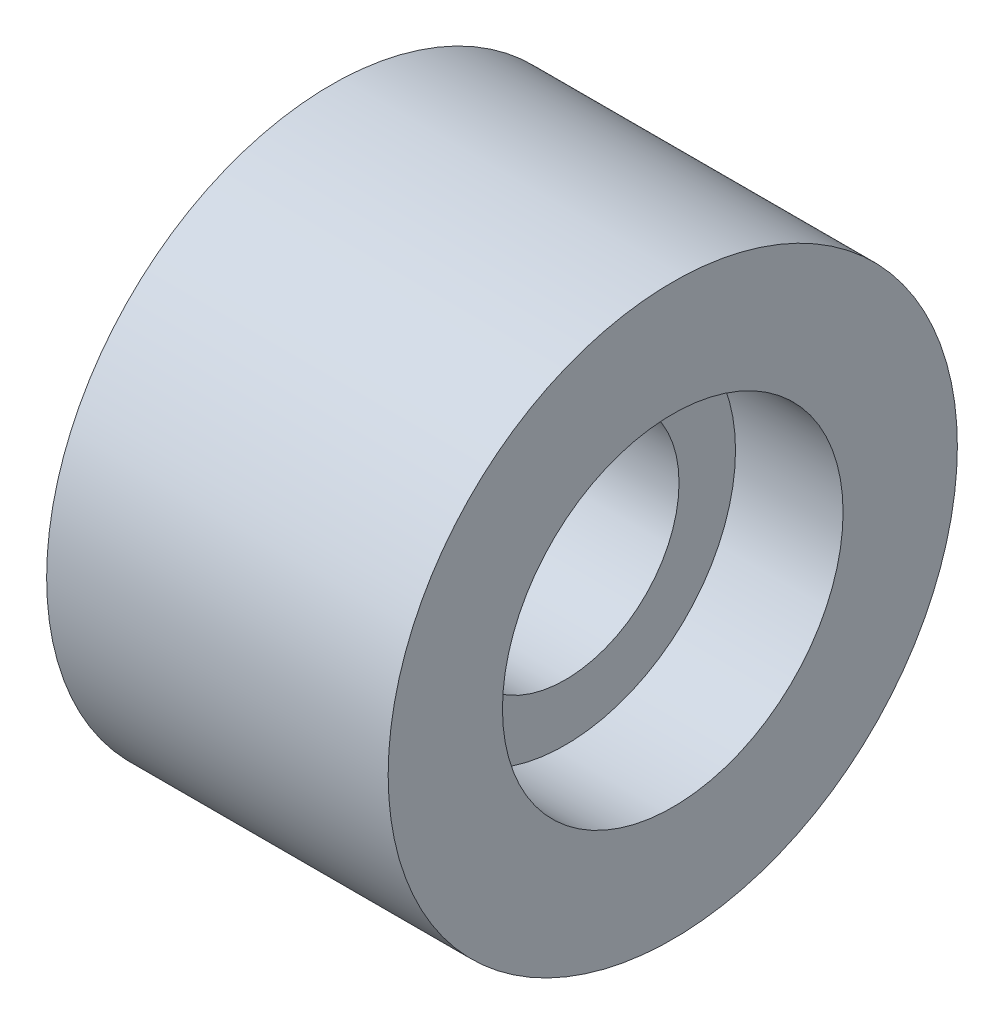
ISO-10303-21;
HEADER;
FILE_DESCRIPTION(('STEP AP214'),'2;1');
FILE_NAME('part.step','',(''),(''),'','','');
FILE_SCHEMA(('AUTOMOTIVE_DESIGN { 1 0 10303 214 1 1 1 1 }'));
ENDSEC;
DATA;
#1=APPLICATION_CONTEXT('core data for automotive mechanical design processes');
#2=APPLICATION_PROTOCOL_DEFINITION('international standard','automotive_design',2000,#1);
#3=PRODUCT_CONTEXT('',#1,'mechanical');
#4=PRODUCT('Part','Part','',(#3));
#5=PRODUCT_RELATED_PRODUCT_CATEGORY('part','',(#4));
#6=PRODUCT_DEFINITION_FORMATION('','',#4);
#7=PRODUCT_DEFINITION_CONTEXT('part definition',#1,'design');
#8=PRODUCT_DEFINITION('design','',#6,#7);
#9=PRODUCT_DEFINITION_SHAPE('','',#8);
#10=(LENGTH_UNIT() NAMED_UNIT(*) SI_UNIT(.MILLI.,.METRE.));
#11=(NAMED_UNIT(*) PLANE_ANGLE_UNIT() SI_UNIT($,.RADIAN.));
#12=(NAMED_UNIT(*) SI_UNIT($,.STERADIAN.) SOLID_ANGLE_UNIT());
#13=UNCERTAINTY_MEASURE_WITH_UNIT(LENGTH_MEASURE(1.E-05),#10,'distance_accuracy_value','');
#14=(GEOMETRIC_REPRESENTATION_CONTEXT(3) GLOBAL_UNCERTAINTY_ASSIGNED_CONTEXT((#13)) GLOBAL_UNIT_ASSIGNED_CONTEXT((#10,
#11,#12)) REPRESENTATION_CONTEXT('',''));
#15=CARTESIAN_POINT('',(0.,0.,0.));
#16=DIRECTION('',(0.,0.,1.));
#17=DIRECTION('',(1.,0.,0.));
#18=AXIS2_PLACEMENT_3D('',#15,#16,#17);
#19=CARTESIAN_POINT('',(6.,0.,0.));
#20=DIRECTION('',(-1.,0.,0.));
#21=DIRECTION('',(0.,0.,1.));
#22=AXIS2_PLACEMENT_3D('',#19,#20,#21);
#23=CYLINDRICAL_SURFACE('',#22,9.5);
#24=CARTESIAN_POINT('',(6.,0.,0.));
#25=DIRECTION('',(1.,0.,0.));
#26=DIRECTION('',(0.,0.,-1.));
#27=AXIS2_PLACEMENT_3D('',#24,#25,#26);
#28=CIRCLE('',#27,9.5);
#29=CARTESIAN_POINT('',(6.,0.,-9.5));
#30=VERTEX_POINT('',#29);
#31=EDGE_CURVE('E51',#30,#30,#28,.T.);
#32=ORIENTED_EDGE('',*,*,#31,.T.);
#33=EDGE_LOOP('',(#32));
#34=FACE_BOUND('',#33,.T.);
#35=CARTESIAN_POINT('',(0.,0.,0.));
#36=DIRECTION('',(1.,0.,0.));
#37=DIRECTION('',(0.,0.,-1.));
#38=AXIS2_PLACEMENT_3D('',#35,#36,#37);
#39=CIRCLE('',#38,9.5);
#40=CARTESIAN_POINT('',(0.,0.,-9.5));
#41=VERTEX_POINT('',#40);
#42=EDGE_CURVE('E46',#41,#41,#39,.T.);
#43=ORIENTED_EDGE('',*,*,#42,.F.);
#44=EDGE_LOOP('',(#43));
#45=FACE_BOUND('',#44,.T.);
#46=ADVANCED_FACE('F43',(#34,#45),#23,.F.);
#47=CARTESIAN_POINT('',(6.,0.,0.));
#48=DIRECTION('',(-1.,0.,0.));
#49=DIRECTION('',(0.,0.,1.));
#50=AXIS2_PLACEMENT_3D('',#47,#48,#49);
#51=CYLINDRICAL_SURFACE('',#50,15.875);
#52=CARTESIAN_POINT('',(6.,0.,0.));
#53=DIRECTION('',(1.,0.,0.));
#54=DIRECTION('',(0.,0.,-1.));
#55=AXIS2_PLACEMENT_3D('',#52,#53,#54);
#56=CIRCLE('',#55,15.875);
#57=CARTESIAN_POINT('',(6.,0.,-15.875));
#58=VERTEX_POINT('',#57);
#59=EDGE_CURVE('E10',#58,#58,#56,.T.);
#60=ORIENTED_EDGE('',*,*,#59,.F.);
#61=EDGE_LOOP('',(#60));
#62=FACE_BOUND('',#61,.T.);
#63=CARTESIAN_POINT('',(-13.050000062,0.,0.));
#64=DIRECTION('',(1.,0.,0.));
#65=DIRECTION('',(0.,0.,-1.));
#66=AXIS2_PLACEMENT_3D('',#63,#64,#65);
#67=CIRCLE('',#66,15.875);
#68=CARTESIAN_POINT('',(-13.050000062,0.,-15.875));
#69=VERTEX_POINT('',#68);
#70=EDGE_CURVE('E64',#69,#69,#67,.T.);
#71=ORIENTED_EDGE('',*,*,#70,.T.);
#72=EDGE_LOOP('',(#71));
#73=FACE_BOUND('',#72,.T.);
#74=ADVANCED_FACE('F89',(#62,#73),#51,.T.);
#75=CARTESIAN_POINT('',(6.,0.,0.));
#76=DIRECTION('',(1.,0.,0.));
#77=DIRECTION('',(0.,0.,-1.));
#78=AXIS2_PLACEMENT_3D('',#75,#76,#77);
#79=PLANE('',#78);
#80=ORIENTED_EDGE('',*,*,#31,.F.);
#81=EDGE_LOOP('',(#80));
#82=FACE_BOUND('',#81,.T.);
#83=ORIENTED_EDGE('',*,*,#59,.T.);
#84=EDGE_LOOP('',(#83));
#85=FACE_BOUND('',#84,.T.);
#86=ADVANCED_FACE('F85',(#82,#85),#79,.T.);
#87=CARTESIAN_POINT('',(0.,0.,0.));
#88=DIRECTION('',(1.,0.,0.));
#89=DIRECTION('',(0.,0.,-1.));
#90=AXIS2_PLACEMENT_3D('',#87,#88,#89);
#91=PLANE('',#90);
#92=CARTESIAN_POINT('',(0.,0.,0.));
#93=DIRECTION('',(1.,0.,0.));
#94=DIRECTION('',(0.,0.,-1.));
#95=AXIS2_PLACEMENT_3D('',#92,#93,#94);
#96=CIRCLE('',#95,6.35);
#97=CARTESIAN_POINT('',(0.,0.,-6.35));
#98=VERTEX_POINT('',#97);
#99=EDGE_CURVE('E59',#98,#98,#96,.T.);
#100=ORIENTED_EDGE('',*,*,#99,.F.);
#101=EDGE_LOOP('',(#100));
#102=FACE_BOUND('',#101,.T.);
#103=ORIENTED_EDGE('',*,*,#42,.T.);
#104=EDGE_LOOP('',(#103));
#105=FACE_BOUND('',#104,.T.);
#106=ADVANCED_FACE('F80',(#102,#105),#91,.T.);
#107=CARTESIAN_POINT('',(-13.050000062,0.,0.));
#108=DIRECTION('',(1.,0.,0.));
#109=DIRECTION('',(0.,0.,-1.));
#110=AXIS2_PLACEMENT_3D('',#107,#108,#109);
#111=CYLINDRICAL_SURFACE('',#110,6.35);
#112=CARTESIAN_POINT('',(-13.050000062,0.,0.));
#113=DIRECTION('',(1.,0.,0.));
#114=DIRECTION('',(0.,0.,-1.));
#115=AXIS2_PLACEMENT_3D('',#112,#113,#114);
#116=CIRCLE('',#115,6.35);
#117=CARTESIAN_POINT('',(-13.050000062,0.,-6.35));
#118=VERTEX_POINT('',#117);
#119=EDGE_CURVE('E65',#118,#118,#116,.T.);
#120=CARTESIAN_POINT('',(-13.050000062,0.,-6.35));
#121=CARTESIAN_POINT('',(-12.9140625613542,0.,-6.35));
#122=CARTESIAN_POINT('',(-12.7781250607083,0.,-6.35));
#123=CARTESIAN_POINT('',(-12.5062500594167,0.,-6.35));
#124=CARTESIAN_POINT('',(-12.3703125587708,0.,-6.35));
#125=CARTESIAN_POINT('',(-12.0984375574792,0.,-6.35));
#126=CARTESIAN_POINT('',(-11.9625000568333,0.,-6.35));
#127=CARTESIAN_POINT('',(-11.6906250555417,0.,-6.35));
#128=CARTESIAN_POINT('',(-11.5546875548958,0.,-6.35));
#129=CARTESIAN_POINT('',(-11.2828125536042,0.,-6.35));
#130=CARTESIAN_POINT('',(-11.1468750529583,0.,-6.35));
#131=CARTESIAN_POINT('',(-10.8750000516667,0.,-6.35));
#132=CARTESIAN_POINT('',(-10.7390625510208,0.,-6.35));
#133=CARTESIAN_POINT('',(-10.4671875497292,0.,-6.35));
#134=CARTESIAN_POINT('',(-10.3312500490833,0.,-6.35));
#135=CARTESIAN_POINT('',(-10.0593750477917,0.,-6.35));
#136=CARTESIAN_POINT('',(-9.92343754714583,0.,-6.35));
#137=CARTESIAN_POINT('',(-9.65156254585417,0.,-6.35));
#138=CARTESIAN_POINT('',(-9.51562504520833,0.,-6.35));
#139=CARTESIAN_POINT('',(-9.24375004391667,0.,-6.35));
#140=CARTESIAN_POINT('',(-9.10781254327083,0.,-6.35));
#141=CARTESIAN_POINT('',(-8.83593754197917,0.,-6.35));
#142=CARTESIAN_POINT('',(-8.70000004133333,0.,-6.35));
#143=CARTESIAN_POINT('',(-8.42812504004167,0.,-6.35));
#144=CARTESIAN_POINT('',(-8.29218753939583,0.,-6.35));
#145=CARTESIAN_POINT('',(-8.02031253810417,0.,-6.35));
#146=CARTESIAN_POINT('',(-7.88437503745833,0.,-6.35));
#147=CARTESIAN_POINT('',(-7.61250003616667,0.,-6.35));
#148=CARTESIAN_POINT('',(-7.47656253552083,0.,-6.35));
#149=CARTESIAN_POINT('',(-7.20468753422917,0.,-6.35));
#150=CARTESIAN_POINT('',(-7.06875003358333,0.,-6.35));
#151=CARTESIAN_POINT('',(-6.79687503229167,0.,-6.35));
#152=CARTESIAN_POINT('',(-6.66093753164583,0.,-6.35));
#153=CARTESIAN_POINT('',(-6.38906253035417,0.,-6.35));
#154=CARTESIAN_POINT('',(-6.25312502970833,0.,-6.35));
#155=CARTESIAN_POINT('',(-5.98125002841667,0.,-6.35));
#156=CARTESIAN_POINT('',(-5.84531252777083,0.,-6.35));
#157=CARTESIAN_POINT('',(-5.57343752647917,0.,-6.35));
#158=CARTESIAN_POINT('',(-5.43750002583333,0.,-6.35));
#159=CARTESIAN_POINT('',(-5.16562502454167,0.,-6.35));
#160=CARTESIAN_POINT('',(-5.02968752389583,0.,-6.35));
#161=CARTESIAN_POINT('',(-4.75781252260417,0.,-6.35));
#162=CARTESIAN_POINT('',(-4.62187502195833,0.,-6.35));
#163=CARTESIAN_POINT('',(-4.35000002066667,0.,-6.35));
#164=CARTESIAN_POINT('',(-4.21406252002083,0.,-6.35));
#165=CARTESIAN_POINT('',(-3.94218751872917,0.,-6.35));
#166=CARTESIAN_POINT('',(-3.80625001808333,0.,-6.35));
#167=CARTESIAN_POINT('',(-3.53437501679167,0.,-6.35));
#168=CARTESIAN_POINT('',(-3.39843751614583,0.,-6.35));
#169=CARTESIAN_POINT('',(-3.12656251485417,0.,-6.35));
#170=CARTESIAN_POINT('',(-2.99062501420833,0.,-6.35));
#171=CARTESIAN_POINT('',(-2.71875001291667,0.,-6.35));
#172=CARTESIAN_POINT('',(-2.58281251227083,0.,-6.35));
#173=CARTESIAN_POINT('',(-2.31093751097917,0.,-6.35));
#174=CARTESIAN_POINT('',(-2.17500001033333,0.,-6.35));
#175=CARTESIAN_POINT('',(-1.90312500904167,0.,-6.35));
#176=CARTESIAN_POINT('',(-1.76718750839583,0.,-6.35));
#177=CARTESIAN_POINT('',(-1.49531250710417,0.,-6.35));
#178=CARTESIAN_POINT('',(-1.35937500645833,0.,-6.35));
#179=CARTESIAN_POINT('',(-1.08750000516667,0.,-6.35));
#180=CARTESIAN_POINT('',(-0.951562504520833,0.,-6.35));
#181=CARTESIAN_POINT('',(-0.679687503229167,0.,-6.35));
#182=CARTESIAN_POINT('',(-0.543750002583334,0.,-6.35));
#183=CARTESIAN_POINT('',(-0.271875001291667,0.,-6.35));
#184=CARTESIAN_POINT('',(-0.135937500645833,0.,-6.35));
#185=CARTESIAN_POINT('',(0.,0.,-6.35));
#186=B_SPLINE_CURVE_WITH_KNOTS('',3,(#120,#121,#122,#123,#124,#125,#126,#127,#128,#129,#130,
#131,#132,#133,#134,#135,#136,#137,#138,#139,#140,#141,#142,#143,#144,#145,#146,#147,#148,#149,
#150,#151,#152,#153,#154,#155,#156,#157,#158,#159,#160,#161,#162,#163,#164,#165,#166,#167,#168,
#169,#170,#171,#172,#173,#174,#175,#176,#177,#178,#179,#180,#181,#182,#183,#184,#185),
.UNSPECIFIED.,.F.,.F.,(4,2,2,2,2,2,2,2,2,2,2,2,2,2,2,2,2,2,2,2,2,2,2,2,2,2,2,2,2,2,2,2,4),(0.,
0.407812501937499,0.815625003875,1.2234375058125,1.63125000775,2.0390625096875,2.446875011625,
2.8546875135625,3.2625000155,3.6703125174375,4.078125019375,4.4859375213125,4.89375002325,
5.3015625251875,5.709375027125,6.1171875290625,6.525000031,6.9328125329375,7.340625034875,
7.7484375368125,8.15625003875,8.5640625406875,8.971875042625,9.3796875445625,9.7875000465,
10.1953125484375,10.603125050375,11.0109375523125,11.41875005425,11.8265625561875,
12.234375058125,12.6421875600625,13.050000062),.UNSPECIFIED.);
#187=EDGE_CURVE('BSEAM74',#118,#98,#186,.T.);
#188=ORIENTED_EDGE('',*,*,#119,.F.);
#189=ORIENTED_EDGE('',*,*,#99,.T.);
#190=ORIENTED_EDGE('',*,*,#187,.T.);
#191=ORIENTED_EDGE('',*,*,#187,.F.);
#192=EDGE_LOOP('',(#188,#190,#189,#191));
#193=FACE_BOUND('',#192,.T.);
#194=ADVANCED_FACE('F74',(#193),#111,.F.);
#195=CARTESIAN_POINT('',(-13.050000062,0.,0.));
#196=DIRECTION('',(1.,0.,0.));
#197=DIRECTION('',(0.,0.,-1.));
#198=AXIS2_PLACEMENT_3D('',#195,#196,#197);
#199=PLANE('',#198);
#200=ORIENTED_EDGE('',*,*,#119,.T.);
#201=EDGE_LOOP('',(#200));
#202=FACE_BOUND('',#201,.T.);
#203=ORIENTED_EDGE('',*,*,#70,.F.);
#204=EDGE_LOOP('',(#203));
#205=FACE_BOUND('',#204,.T.);
#206=ADVANCED_FACE('F72',(#202,#205),#199,.F.);
#207=CLOSED_SHELL('',(#46,#74,#86,#106,#194,#206));
#208=MANIFOLD_SOLID_BREP('B2',#207);
#209=ADVANCED_BREP_SHAPE_REPRESENTATION('',(#18,#208),#14);
#210=SHAPE_DEFINITION_REPRESENTATION(#9,#209);
ENDSEC;
END-ISO-10303-21;
